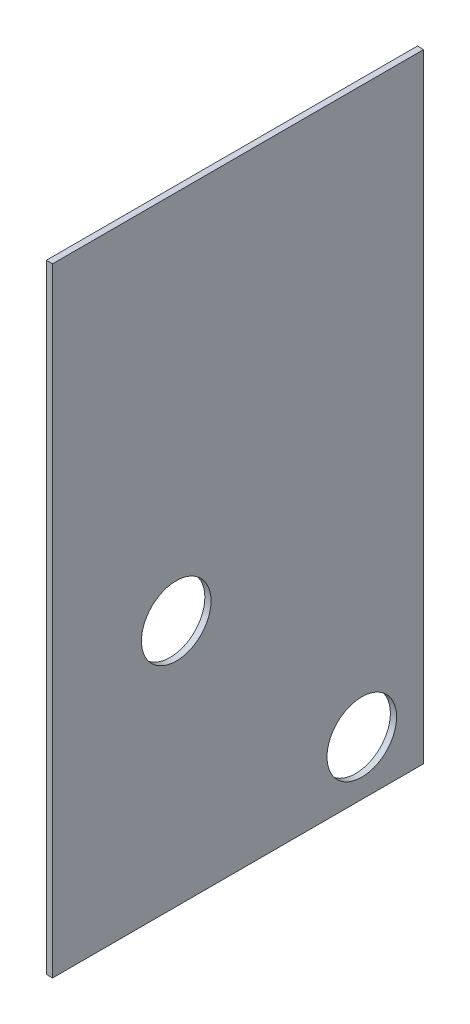
ISO-10303-21;
HEADER;
FILE_DESCRIPTION(('STEP AP214'),'2;1');
FILE_NAME('part.step','',(''),(''),'','','');
FILE_SCHEMA(('AUTOMOTIVE_DESIGN { 1 0 10303 214 1 1 1 1 }'));
ENDSEC;
DATA;
#1=APPLICATION_CONTEXT('core data for automotive mechanical design processes');
#2=APPLICATION_PROTOCOL_DEFINITION('international standard','automotive_design',2000,#1);
#3=PRODUCT_CONTEXT('',#1,'mechanical');
#4=PRODUCT('Part','Part','',(#3));
#5=PRODUCT_RELATED_PRODUCT_CATEGORY('part','',(#4));
#6=PRODUCT_DEFINITION_FORMATION('','',#4);
#7=PRODUCT_DEFINITION_CONTEXT('part definition',#1,'design');
#8=PRODUCT_DEFINITION('design','',#6,#7);
#9=PRODUCT_DEFINITION_SHAPE('','',#8);
#10=(LENGTH_UNIT() NAMED_UNIT(*) SI_UNIT(.MILLI.,.METRE.));
#11=(NAMED_UNIT(*) PLANE_ANGLE_UNIT() SI_UNIT($,.RADIAN.));
#12=(NAMED_UNIT(*) SI_UNIT($,.STERADIAN.) SOLID_ANGLE_UNIT());
#13=UNCERTAINTY_MEASURE_WITH_UNIT(LENGTH_MEASURE(1.E-05),#10,'distance_accuracy_value','');
#14=(GEOMETRIC_REPRESENTATION_CONTEXT(3) GLOBAL_UNCERTAINTY_ASSIGNED_CONTEXT((#13)) GLOBAL_UNIT_ASSIGNED_CONTEXT((#10,
#11,#12)) REPRESENTATION_CONTEXT('',''));
#15=CARTESIAN_POINT('',(0.,0.,0.));
#16=DIRECTION('',(0.,0.,1.));
#17=DIRECTION('',(1.,0.,0.));
#18=AXIS2_PLACEMENT_3D('',#15,#16,#17);
#19=CARTESIAN_POINT('',(1.27,-127.,-76.2));
#20=DIRECTION('',(0.,0.,1.));
#21=DIRECTION('',(1.,0.,0.));
#22=AXIS2_PLACEMENT_3D('',#19,#20,#21);
#23=PLANE('',#22);
#24=DIRECTION('',(0.,1.,0.));
#25=VECTOR('',#24,1.);
#26=CARTESIAN_POINT('',(-1.27,-127.,-76.2));
#27=LINE('',#26,#25);
#28=CARTESIAN_POINT('',(-1.27,-127.,-76.2));
#29=VERTEX_POINT('',#28);
#30=CARTESIAN_POINT('',(-1.27,127.,-76.2));
#31=VERTEX_POINT('',#30);
#32=EDGE_CURVE('E107',#29,#31,#27,.T.);
#33=ORIENTED_EDGE('',*,*,#32,.T.);
#34=DIRECTION('',(-1.,0.,0.));
#35=VECTOR('',#34,1.);
#36=CARTESIAN_POINT('',(1.27,127.,-76.2));
#37=LINE('',#36,#35);
#38=CARTESIAN_POINT('',(1.27,127.,-76.2));
#39=VERTEX_POINT('',#38);
#40=EDGE_CURVE('E11',#39,#31,#37,.T.);
#41=ORIENTED_EDGE('',*,*,#40,.F.);
#42=DIRECTION('',(0.,1.,0.));
#43=VECTOR('',#42,1.);
#44=CARTESIAN_POINT('',(1.27,-127.,-76.2));
#45=LINE('',#44,#43);
#46=CARTESIAN_POINT('',(1.27,-127.,-76.2));
#47=VERTEX_POINT('',#46);
#48=EDGE_CURVE('E91',#47,#39,#45,.T.);
#49=ORIENTED_EDGE('',*,*,#48,.F.);
#50=DIRECTION('',(-1.,0.,0.));
#51=VECTOR('',#50,1.);
#52=CARTESIAN_POINT('',(1.27,-127.,-76.2));
#53=LINE('',#52,#51);
#54=EDGE_CURVE('E103',#47,#29,#53,.T.);
#55=ORIENTED_EDGE('',*,*,#54,.T.);
#56=EDGE_LOOP('',(#33,#41,#49,#55));
#57=FACE_BOUND('',#56,.T.);
#58=ADVANCED_FACE('F39',(#57),#23,.F.);
#59=CARTESIAN_POINT('',(1.27,127.,76.2));
#60=DIRECTION('',(0.,-1.,0.));
#61=DIRECTION('',(0.,0.,-1.));
#62=AXIS2_PLACEMENT_3D('',#59,#60,#61);
#63=PLANE('',#62);
#64=DIRECTION('',(0.,0.,1.));
#65=VECTOR('',#64,1.);
#66=CARTESIAN_POINT('',(-1.27,127.,76.2));
#67=LINE('',#66,#65);
#68=CARTESIAN_POINT('',(-1.27,127.,76.2));
#69=VERTEX_POINT('',#68);
#70=EDGE_CURVE('E96',#31,#69,#67,.T.);
#71=ORIENTED_EDGE('',*,*,#70,.T.);
#72=DIRECTION('',(-1.,0.,0.));
#73=VECTOR('',#72,1.);
#74=CARTESIAN_POINT('',(1.27,127.,76.2));
#75=LINE('',#74,#73);
#76=CARTESIAN_POINT('',(1.27,127.,76.2));
#77=VERTEX_POINT('',#76);
#78=EDGE_CURVE('E48',#77,#69,#75,.T.);
#79=ORIENTED_EDGE('',*,*,#78,.F.);
#80=DIRECTION('',(0.,0.,1.));
#81=VECTOR('',#80,1.);
#82=CARTESIAN_POINT('',(1.27,127.,76.2));
#83=LINE('',#82,#81);
#84=EDGE_CURVE('E86',#39,#77,#83,.T.);
#85=ORIENTED_EDGE('',*,*,#84,.F.);
#86=ORIENTED_EDGE('',*,*,#40,.T.);
#87=EDGE_LOOP('',(#71,#79,#85,#86));
#88=FACE_BOUND('',#87,.T.);
#89=ADVANCED_FACE('F95',(#88),#63,.F.);
#90=CARTESIAN_POINT('',(1.27,-127.,76.2));
#91=DIRECTION('',(0.,0.,-1.));
#92=DIRECTION('',(-1.,0.,0.));
#93=AXIS2_PLACEMENT_3D('',#90,#91,#92);
#94=PLANE('',#93);
#95=DIRECTION('',(0.,-1.,0.));
#96=VECTOR('',#95,1.);
#97=CARTESIAN_POINT('',(-1.27,-127.,76.2));
#98=LINE('',#97,#96);
#99=CARTESIAN_POINT('',(-1.27,-127.,76.2));
#100=VERTEX_POINT('',#99);
#101=EDGE_CURVE('E73',#69,#100,#98,.T.);
#102=ORIENTED_EDGE('',*,*,#101,.T.);
#103=DIRECTION('',(-1.,0.,0.));
#104=VECTOR('',#103,1.);
#105=CARTESIAN_POINT('',(1.27,-127.,76.2));
#106=LINE('',#105,#104);
#107=CARTESIAN_POINT('',(1.27,-127.,76.2));
#108=VERTEX_POINT('',#107);
#109=EDGE_CURVE('E98',#108,#100,#106,.T.);
#110=ORIENTED_EDGE('',*,*,#109,.F.);
#111=DIRECTION('',(0.,-1.,0.));
#112=VECTOR('',#111,1.);
#113=CARTESIAN_POINT('',(1.27,-127.,76.2));
#114=LINE('',#113,#112);
#115=EDGE_CURVE('E89',#77,#108,#114,.T.);
#116=ORIENTED_EDGE('',*,*,#115,.F.);
#117=ORIENTED_EDGE('',*,*,#78,.T.);
#118=EDGE_LOOP('',(#102,#110,#116,#117));
#119=FACE_BOUND('',#118,.T.);
#120=ADVANCED_FACE('F99',(#119),#94,.F.);
#121=CARTESIAN_POINT('',(1.27,-127.,76.2));
#122=DIRECTION('',(0.,1.,0.));
#123=DIRECTION('',(0.,0.,1.));
#124=AXIS2_PLACEMENT_3D('',#121,#122,#123);
#125=PLANE('',#124);
#126=DIRECTION('',(0.,0.,-1.));
#127=VECTOR('',#126,1.);
#128=CARTESIAN_POINT('',(-1.27,-127.,76.2));
#129=LINE('',#128,#127);
#130=EDGE_CURVE('E79',#100,#29,#129,.T.);
#131=ORIENTED_EDGE('',*,*,#130,.T.);
#132=ORIENTED_EDGE('',*,*,#54,.F.);
#133=DIRECTION('',(0.,0.,-1.));
#134=VECTOR('',#133,1.);
#135=CARTESIAN_POINT('',(1.27,-127.,76.2));
#136=LINE('',#135,#134);
#137=EDGE_CURVE('E56',#108,#47,#136,.T.);
#138=ORIENTED_EDGE('',*,*,#137,.F.);
#139=ORIENTED_EDGE('',*,*,#109,.T.);
#140=EDGE_LOOP('',(#131,#132,#138,#139));
#141=FACE_BOUND('',#140,.T.);
#142=ADVANCED_FACE('F121',(#141),#125,.F.);
#143=CARTESIAN_POINT('',(1.27,0.,0.));
#144=DIRECTION('',(-1.,0.,0.));
#145=DIRECTION('',(0.,0.,1.));
#146=AXIS2_PLACEMENT_3D('',#143,#144,#145);
#147=PLANE('',#146);
#148=CARTESIAN_POINT('',(1.27,-104.775,-50.8));
#149=DIRECTION('',(1.,0.,0.));
#150=DIRECTION('',(0.,0.,-1.));
#151=AXIS2_PLACEMENT_3D('',#148,#149,#150);
#152=CIRCLE('',#151,14.2875);
#153=CARTESIAN_POINT('',(1.27,-104.775,-65.0875));
#154=VERTEX_POINT('',#153);
#155=EDGE_CURVE('E139',#154,#154,#152,.T.);
#156=ORIENTED_EDGE('',*,*,#155,.F.);
#157=EDGE_LOOP('',(#156));
#158=FACE_BOUND('',#157,.T.);
#159=CARTESIAN_POINT('',(1.27,-25.4,25.4));
#160=DIRECTION('',(1.,0.,0.));
#161=DIRECTION('',(0.,0.,-1.));
#162=AXIS2_PLACEMENT_3D('',#159,#160,#161);
#163=CIRCLE('',#162,14.2875);
#164=CARTESIAN_POINT('',(1.27,-25.4,11.1125));
#165=VERTEX_POINT('',#164);
#166=EDGE_CURVE('E131',#165,#165,#163,.T.);
#167=ORIENTED_EDGE('',*,*,#166,.F.);
#168=EDGE_LOOP('',(#167));
#169=FACE_BOUND('',#168,.T.);
#170=ORIENTED_EDGE('',*,*,#48,.T.);
#171=ORIENTED_EDGE('',*,*,#84,.T.);
#172=ORIENTED_EDGE('',*,*,#115,.T.);
#173=ORIENTED_EDGE('',*,*,#137,.T.);
#174=EDGE_LOOP('',(#170,#171,#172,#173));
#175=FACE_BOUND('',#174,.T.);
#176=ADVANCED_FACE('F87',(#158,#169,#175),#147,.F.);
#177=CARTESIAN_POINT('',(-1.27,0.,0.));
#178=DIRECTION('',(-1.,0.,0.));
#179=DIRECTION('',(0.,0.,1.));
#180=AXIS2_PLACEMENT_3D('',#177,#178,#179);
#181=PLANE('',#180);
#182=CARTESIAN_POINT('',(-1.27,-104.775,-50.8));
#183=DIRECTION('',(-1.,0.,0.));
#184=DIRECTION('',(0.,0.,1.));
#185=AXIS2_PLACEMENT_3D('',#182,#183,#184);
#186=CIRCLE('',#185,14.2875);
#187=CARTESIAN_POINT('',(-1.27,-104.775,-36.5125));
#188=VERTEX_POINT('',#187);
#189=EDGE_CURVE('E135',#188,#188,#186,.F.);
#190=ORIENTED_EDGE('',*,*,#189,.T.);
#191=EDGE_LOOP('',(#190));
#192=FACE_BOUND('',#191,.T.);
#193=CARTESIAN_POINT('',(-1.27,-25.4,25.4));
#194=DIRECTION('',(-1.,0.,0.));
#195=DIRECTION('',(0.,0.,1.));
#196=AXIS2_PLACEMENT_3D('',#193,#194,#195);
#197=CIRCLE('',#196,14.2875);
#198=CARTESIAN_POINT('',(-1.27,-25.4,11.1125));
#199=VERTEX_POINT('',#198);
#200=EDGE_CURVE('E111',#199,#199,#197,.F.);
#201=ORIENTED_EDGE('',*,*,#200,.T.);
#202=EDGE_LOOP('',(#201));
#203=FACE_BOUND('',#202,.T.);
#204=ORIENTED_EDGE('',*,*,#32,.F.);
#205=ORIENTED_EDGE('',*,*,#130,.F.);
#206=ORIENTED_EDGE('',*,*,#101,.F.);
#207=ORIENTED_EDGE('',*,*,#70,.F.);
#208=EDGE_LOOP('',(#204,#205,#206,#207));
#209=FACE_BOUND('',#208,.T.);
#210=ADVANCED_FACE('F124',(#192,#203,#209),#181,.T.);
#211=CARTESIAN_POINT('',(-41.6811525448112,-25.4,25.4));
#212=DIRECTION('',(1.,0.,0.));
#213=DIRECTION('',(0.,0.,-1.));
#214=AXIS2_PLACEMENT_3D('',#211,#212,#213);
#215=CYLINDRICAL_SURFACE('',#214,14.2875);
#216=CARTESIAN_POINT('',(1.27,-25.4,11.1125));
#217=CARTESIAN_POINT('',(1.24354166666667,-25.4,11.1125));
#218=CARTESIAN_POINT('',(1.21708333333333,-25.4,11.1125));
#219=CARTESIAN_POINT('',(1.16416666666667,-25.4,11.1125));
#220=CARTESIAN_POINT('',(1.13770833333333,-25.4,11.1125));
#221=CARTESIAN_POINT('',(1.08479166666667,-25.4,11.1125));
#222=CARTESIAN_POINT('',(1.05833333333333,-25.4,11.1125));
#223=CARTESIAN_POINT('',(1.00541666666667,-25.4,11.1125));
#224=CARTESIAN_POINT('',(0.978958333333335,-25.4,11.1125));
#225=CARTESIAN_POINT('',(0.926041666666669,-25.4,11.1125));
#226=CARTESIAN_POINT('',(0.899583333333336,-25.4,11.1125));
#227=CARTESIAN_POINT('',(0.846666666666669,-25.4,11.1125));
#228=CARTESIAN_POINT('',(0.820208333333336,-25.4,11.1125));
#229=CARTESIAN_POINT('',(0.76729166666667,-25.4,11.1125));
#230=CARTESIAN_POINT('',(0.740833333333336,-25.4,11.1125));
#231=CARTESIAN_POINT('',(0.68791666666667,-25.4,11.1125));
#232=CARTESIAN_POINT('',(0.661458333333337,-25.4,11.1125));
#233=CARTESIAN_POINT('',(0.608541666666668,-25.4,11.1125));
#234=CARTESIAN_POINT('',(0.582083333333333,-25.4,11.1125));
#235=CARTESIAN_POINT('',(0.529166666666664,-25.4,11.1125));
#236=CARTESIAN_POINT('',(0.502708333333331,-25.4,11.1125));
#237=CARTESIAN_POINT('',(0.449791666666664,-25.4,11.1125));
#238=CARTESIAN_POINT('',(0.423333333333331,-25.4,11.1125));
#239=CARTESIAN_POINT('',(0.370416666666665,-25.4,11.1125));
#240=CARTESIAN_POINT('',(0.343958333333332,-25.4,11.1125));
#241=CARTESIAN_POINT('',(0.291041666666665,-25.4,11.1125));
#242=CARTESIAN_POINT('',(0.264583333333332,-25.4,11.1125));
#243=CARTESIAN_POINT('',(0.211666666666666,-25.4,11.1125));
#244=CARTESIAN_POINT('',(0.185208333333332,-25.4,11.1125));
#245=CARTESIAN_POINT('',(0.132291666666666,-25.4,11.1125));
#246=CARTESIAN_POINT('',(0.105833333333333,-25.4,11.1125));
#247=CARTESIAN_POINT('',(0.0529166666666664,-25.4,11.1125));
#248=CARTESIAN_POINT('',(0.0264583333333332,-25.4,11.1125));
#249=CARTESIAN_POINT('',(-0.0264583333333332,-25.4,11.1125));
#250=CARTESIAN_POINT('',(-0.0529166666666664,-25.4,11.1125));
#251=CARTESIAN_POINT('',(-0.105833333333333,-25.4,11.1125));
#252=CARTESIAN_POINT('',(-0.132291666666666,-25.4,11.1125));
#253=CARTESIAN_POINT('',(-0.185208333333332,-25.4,11.1125));
#254=CARTESIAN_POINT('',(-0.211666666666666,-25.4,11.1125));
#255=CARTESIAN_POINT('',(-0.264583333333332,-25.4,11.1125));
#256=CARTESIAN_POINT('',(-0.291041666666665,-25.4,11.1125));
#257=CARTESIAN_POINT('',(-0.343958333333332,-25.4,11.1125));
#258=CARTESIAN_POINT('',(-0.370416666666665,-25.4,11.1125));
#259=CARTESIAN_POINT('',(-0.423333333333331,-25.4,11.1125));
#260=CARTESIAN_POINT('',(-0.449791666666664,-25.4,11.1125));
#261=CARTESIAN_POINT('',(-0.502708333333331,-25.4,11.1125));
#262=CARTESIAN_POINT('',(-0.529166666666664,-25.4,11.1125));
#263=CARTESIAN_POINT('',(-0.582083333333333,-25.4,11.1125));
#264=CARTESIAN_POINT('',(-0.608541666666668,-25.4,11.1125));
#265=CARTESIAN_POINT('',(-0.661458333333337,-25.4,11.1125));
#266=CARTESIAN_POINT('',(-0.68791666666667,-25.4,11.1125));
#267=CARTESIAN_POINT('',(-0.740833333333336,-25.4,11.1125));
#268=CARTESIAN_POINT('',(-0.76729166666667,-25.4,11.1125));
#269=CARTESIAN_POINT('',(-0.820208333333336,-25.4,11.1125));
#270=CARTESIAN_POINT('',(-0.846666666666669,-25.4,11.1125));
#271=CARTESIAN_POINT('',(-0.899583333333336,-25.4,11.1125));
#272=CARTESIAN_POINT('',(-0.926041666666669,-25.4,11.1125));
#273=CARTESIAN_POINT('',(-0.978958333333335,-25.4,11.1125));
#274=CARTESIAN_POINT('',(-1.00541666666667,-25.4,11.1125));
#275=CARTESIAN_POINT('',(-1.05833333333333,-25.4,11.1125));
#276=CARTESIAN_POINT('',(-1.08479166666667,-25.4,11.1125));
#277=CARTESIAN_POINT('',(-1.13770833333333,-25.4,11.1125));
#278=CARTESIAN_POINT('',(-1.16416666666667,-25.4,11.1125));
#279=CARTESIAN_POINT('',(-1.21708333333333,-25.4,11.1125));
#280=CARTESIAN_POINT('',(-1.24354166666667,-25.4,11.1125));
#281=CARTESIAN_POINT('',(-1.27,-25.4,11.1125));
#282=B_SPLINE_CURVE_WITH_KNOTS('',3,(#216,#217,#218,#219,#220,#221,#222,#223,#224,#225,#226,
#227,#228,#229,#230,#231,#232,#233,#234,#235,#236,#237,#238,#239,#240,#241,#242,#243,#244,#245,
#246,#247,#248,#249,#250,#251,#252,#253,#254,#255,#256,#257,#258,#259,#260,#261,#262,#263,#264,
#265,#266,#267,#268,#269,#270,#271,#272,#273,#274,#275,#276,#277,#278,#279,#280,#281),
.UNSPECIFIED.,.F.,.F.,(4,2,2,2,2,2,2,2,2,2,2,2,2,2,2,2,2,2,2,2,2,2,2,2,2,2,2,2,2,2,2,2,4),(0.,
0.0793749999999996,0.158749999999999,0.238124999999999,0.317499999999998,0.396874999999998,
0.476249999999998,0.555624999999997,0.634999999999997,0.714375000000003,0.793750000000003,
0.873125000000002,0.952500000000002,1.031875,1.11125,1.190625,1.27,1.349375,1.42875,1.508125,
1.5875,1.666875,1.74625,1.825625,1.905,1.984375,2.06375,2.143125,2.2225,2.301875,2.38125,
2.460625,2.54),.UNSPECIFIED.);
#283=EDGE_CURVE('BSEAM152',#165,#199,#282,.T.);
#284=ORIENTED_EDGE('',*,*,#166,.T.);
#285=ORIENTED_EDGE('',*,*,#200,.F.);
#286=ORIENTED_EDGE('',*,*,#283,.T.);
#287=ORIENTED_EDGE('',*,*,#283,.F.);
#288=EDGE_LOOP('',(#284,#286,#285,#287));
#289=FACE_BOUND('',#288,.T.);
#290=ADVANCED_FACE('F152',(#289),#215,.F.);
#291=CARTESIAN_POINT('',(-41.6811525448112,-104.775,-50.8));
#292=DIRECTION('',(1.,0.,0.));
#293=DIRECTION('',(0.,0.,-1.));
#294=AXIS2_PLACEMENT_3D('',#291,#292,#293);
#295=CYLINDRICAL_SURFACE('',#294,14.2875);
#296=ORIENTED_EDGE('',*,*,#155,.T.);
#297=EDGE_LOOP('',(#296));
#298=FACE_BOUND('',#297,.T.);
#299=ORIENTED_EDGE('',*,*,#189,.F.);
#300=EDGE_LOOP('',(#299));
#301=FACE_BOUND('',#300,.T.);
#302=ADVANCED_FACE('F144',(#298,#301),#295,.F.);
#303=CLOSED_SHELL('',(#58,#89,#120,#142,#176,#210,#290,#302));
#304=MANIFOLD_SOLID_BREP('B2',#303);
#305=ADVANCED_BREP_SHAPE_REPRESENTATION('',(#18,#304),#14);
#306=SHAPE_DEFINITION_REPRESENTATION(#9,#305);
ENDSEC;
END-ISO-10303-21;
